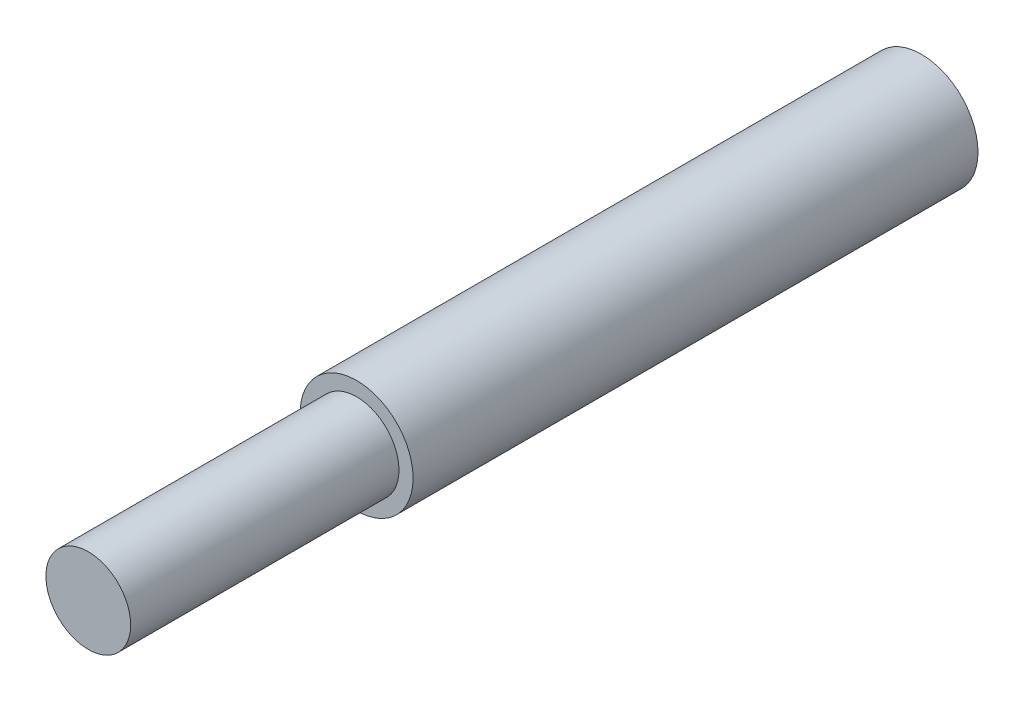
ISO-10303-21;
HEADER;
FILE_DESCRIPTION(('STEP AP214'),'2;1');
FILE_NAME('part.step','',(''),(''),'','','');
FILE_SCHEMA(('AUTOMOTIVE_DESIGN { 1 0 10303 214 1 1 1 1 }'));
ENDSEC;
DATA;
#1=APPLICATION_CONTEXT('core data for automotive mechanical design processes');
#2=APPLICATION_PROTOCOL_DEFINITION('international standard','automotive_design',2000,#1);
#3=PRODUCT_CONTEXT('',#1,'mechanical');
#4=PRODUCT('Part','Part','',(#3));
#5=PRODUCT_RELATED_PRODUCT_CATEGORY('part','',(#4));
#6=PRODUCT_DEFINITION_FORMATION('','',#4);
#7=PRODUCT_DEFINITION_CONTEXT('part definition',#1,'design');
#8=PRODUCT_DEFINITION('design','',#6,#7);
#9=PRODUCT_DEFINITION_SHAPE('','',#8);
#10=(LENGTH_UNIT() NAMED_UNIT(*) SI_UNIT(.MILLI.,.METRE.));
#11=(NAMED_UNIT(*) PLANE_ANGLE_UNIT() SI_UNIT($,.RADIAN.));
#12=(NAMED_UNIT(*) SI_UNIT($,.STERADIAN.) SOLID_ANGLE_UNIT());
#13=UNCERTAINTY_MEASURE_WITH_UNIT(LENGTH_MEASURE(1.E-05),#10,'distance_accuracy_value','');
#14=(GEOMETRIC_REPRESENTATION_CONTEXT(3) GLOBAL_UNCERTAINTY_ASSIGNED_CONTEXT((#13)) GLOBAL_UNIT_ASSIGNED_CONTEXT((#10,
#11,#12)) REPRESENTATION_CONTEXT('',''));
#15=CARTESIAN_POINT('',(0.,0.,0.));
#16=DIRECTION('',(0.,0.,1.));
#17=DIRECTION('',(1.,0.,0.));
#18=AXIS2_PLACEMENT_3D('',#15,#16,#17);
#19=CARTESIAN_POINT('',(0.,0.,40.));
#20=DIRECTION('',(0.,0.,-1.));
#21=DIRECTION('',(-1.,0.,0.));
#22=AXIS2_PLACEMENT_3D('',#19,#20,#21);
#23=CYLINDRICAL_SURFACE('',#22,4.);
#24=CARTESIAN_POINT('',(0.,0.,40.));
#25=DIRECTION('',(0.,0.,1.));
#26=DIRECTION('',(1.,0.,0.));
#27=AXIS2_PLACEMENT_3D('',#24,#25,#26);
#28=CIRCLE('',#27,4.);
#29=CARTESIAN_POINT('',(4.,0.,40.));
#30=VERTEX_POINT('',#29);
#31=EDGE_CURVE('E42',#30,#30,#28,.T.);
#32=ORIENTED_EDGE('',*,*,#31,.F.);
#33=EDGE_LOOP('',(#32));
#34=FACE_BOUND('',#33,.T.);
#35=CARTESIAN_POINT('',(0.,0.,0.));
#36=DIRECTION('',(0.,0.,1.));
#37=DIRECTION('',(1.,0.,0.));
#38=AXIS2_PLACEMENT_3D('',#35,#36,#37);
#39=CIRCLE('',#38,4.);
#40=CARTESIAN_POINT('',(4.,0.,0.));
#41=VERTEX_POINT('',#40);
#42=EDGE_CURVE('E37',#41,#41,#39,.T.);
#43=ORIENTED_EDGE('',*,*,#42,.T.);
#44=EDGE_LOOP('',(#43));
#45=FACE_BOUND('',#44,.T.);
#46=ADVANCED_FACE('F40',(#34,#45),#23,.T.);
#47=CARTESIAN_POINT('',(0.,0.,40.));
#48=DIRECTION('',(0.,0.,1.));
#49=DIRECTION('',(1.,0.,0.));
#50=AXIS2_PLACEMENT_3D('',#47,#48,#49);
#51=PLANE('',#50);
#52=CARTESIAN_POINT('',(0.,0.,40.));
#53=DIRECTION('',(0.,0.,1.));
#54=DIRECTION('',(1.,0.,0.));
#55=AXIS2_PLACEMENT_3D('',#52,#53,#54);
#56=CIRCLE('',#55,3.);
#57=CARTESIAN_POINT('',(3.,0.,40.));
#58=VERTEX_POINT('',#57);
#59=EDGE_CURVE('E10',#58,#58,#56,.T.);
#60=ORIENTED_EDGE('',*,*,#59,.F.);
#61=EDGE_LOOP('',(#60));
#62=FACE_BOUND('',#61,.T.);
#63=ORIENTED_EDGE('',*,*,#31,.T.);
#64=EDGE_LOOP('',(#63));
#65=FACE_BOUND('',#64,.T.);
#66=ADVANCED_FACE('F62',(#62,#65),#51,.T.);
#67=CARTESIAN_POINT('',(0.,0.,0.));
#68=DIRECTION('',(0.,0.,1.));
#69=DIRECTION('',(1.,0.,0.));
#70=AXIS2_PLACEMENT_3D('',#67,#68,#69);
#71=PLANE('',#70);
#72=ORIENTED_EDGE('',*,*,#42,.F.);
#73=EDGE_LOOP('',(#72));
#74=FACE_BOUND('',#73,.T.);
#75=ADVANCED_FACE('F59',(#74),#71,.F.);
#76=CARTESIAN_POINT('',(0.,0.,59.));
#77=DIRECTION('',(0.,0.,-1.));
#78=DIRECTION('',(-1.,0.,0.));
#79=AXIS2_PLACEMENT_3D('',#76,#77,#78);
#80=CYLINDRICAL_SURFACE('',#79,3.);
#81=CARTESIAN_POINT('',(0.,0.,59.));
#82=DIRECTION('',(0.,0.,1.));
#83=DIRECTION('',(1.,0.,0.));
#84=AXIS2_PLACEMENT_3D('',#81,#82,#83);
#85=CIRCLE('',#84,3.);
#86=CARTESIAN_POINT('',(3.,0.,59.));
#87=VERTEX_POINT('',#86);
#88=EDGE_CURVE('E49',#87,#87,#85,.T.);
#89=ORIENTED_EDGE('',*,*,#88,.F.);
#90=EDGE_LOOP('',(#89));
#91=FACE_BOUND('',#90,.T.);
#92=ORIENTED_EDGE('',*,*,#59,.T.);
#93=EDGE_LOOP('',(#92));
#94=FACE_BOUND('',#93,.T.);
#95=ADVANCED_FACE('F58',(#91,#94),#80,.T.);
#96=CARTESIAN_POINT('',(0.,0.,59.));
#97=DIRECTION('',(0.,0.,1.));
#98=DIRECTION('',(1.,0.,0.));
#99=AXIS2_PLACEMENT_3D('',#96,#97,#98);
#100=PLANE('',#99);
#101=ORIENTED_EDGE('',*,*,#88,.T.);
#102=EDGE_LOOP('',(#101));
#103=FACE_BOUND('',#102,.T.);
#104=ADVANCED_FACE('F70',(#103),#100,.T.);
#105=CLOSED_SHELL('',(#46,#66,#75,#95,#104));
#106=MANIFOLD_SOLID_BREP('B2',#105);
#107=ADVANCED_BREP_SHAPE_REPRESENTATION('',(#18,#106),#14);
#108=SHAPE_DEFINITION_REPRESENTATION(#9,#107);
ENDSEC;
END-ISO-10303-21;
